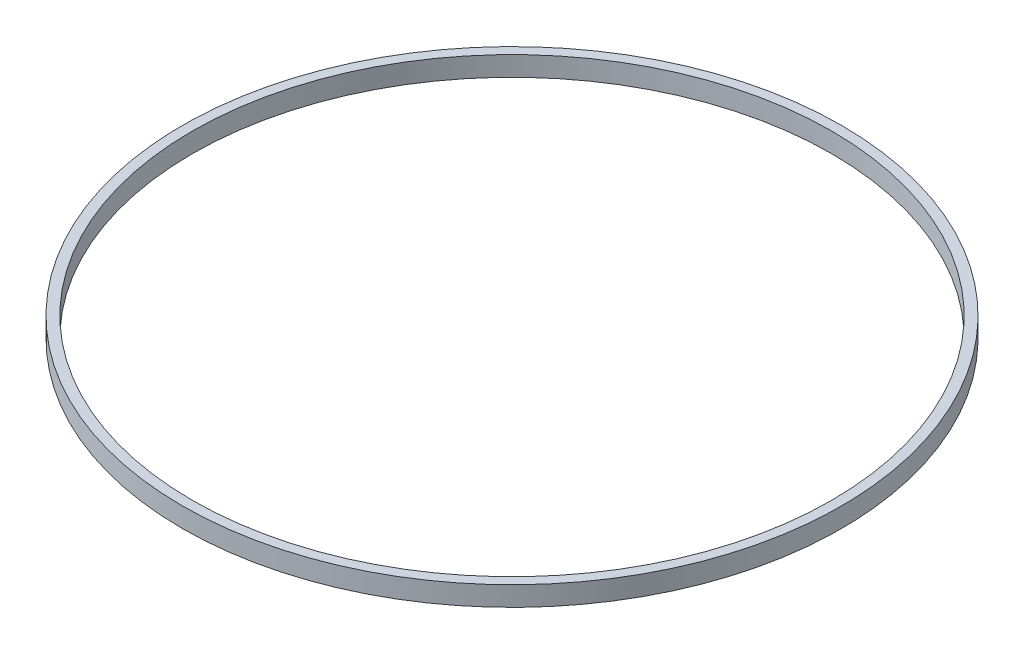
ISO-10303-21;
HEADER;
FILE_DESCRIPTION(('STEP AP214'),'2;1');
FILE_NAME('part.step','',(''),(''),'','','');
FILE_SCHEMA(('AUTOMOTIVE_DESIGN { 1 0 10303 214 1 1 1 1 }'));
ENDSEC;
DATA;
#1=APPLICATION_CONTEXT('core data for automotive mechanical design processes');
#2=APPLICATION_PROTOCOL_DEFINITION('international standard','automotive_design',2000,#1);
#3=PRODUCT_CONTEXT('',#1,'mechanical');
#4=PRODUCT('Part','Part','',(#3));
#5=PRODUCT_RELATED_PRODUCT_CATEGORY('part','',(#4));
#6=PRODUCT_DEFINITION_FORMATION('','',#4);
#7=PRODUCT_DEFINITION_CONTEXT('part definition',#1,'design');
#8=PRODUCT_DEFINITION('design','',#6,#7);
#9=PRODUCT_DEFINITION_SHAPE('','',#8);
#10=(LENGTH_UNIT() NAMED_UNIT(*) SI_UNIT(.MILLI.,.METRE.));
#11=(NAMED_UNIT(*) PLANE_ANGLE_UNIT() SI_UNIT($,.RADIAN.));
#12=(NAMED_UNIT(*) SI_UNIT($,.STERADIAN.) SOLID_ANGLE_UNIT());
#13=UNCERTAINTY_MEASURE_WITH_UNIT(LENGTH_MEASURE(1.E-05),#10,'distance_accuracy_value','');
#14=(GEOMETRIC_REPRESENTATION_CONTEXT(3) GLOBAL_UNCERTAINTY_ASSIGNED_CONTEXT((#13)) GLOBAL_UNIT_ASSIGNED_CONTEXT((#10,
#11,#12)) REPRESENTATION_CONTEXT('',''));
#15=CARTESIAN_POINT('',(0.,0.,0.));
#16=DIRECTION('',(0.,0.,1.));
#17=DIRECTION('',(1.,0.,0.));
#18=AXIS2_PLACEMENT_3D('',#15,#16,#17);
#19=CARTESIAN_POINT('',(0.,4.,0.));
#20=DIRECTION('',(0.,1.,0.));
#21=DIRECTION('',(0.,0.,1.));
#22=AXIS2_PLACEMENT_3D('',#19,#20,#21);
#23=PLANE('',#22);
#24=CARTESIAN_POINT('',(0.,4.,0.));
#25=DIRECTION('',(0.,1.,0.));
#26=DIRECTION('',(0.,0.,1.));
#27=AXIS2_PLACEMENT_3D('',#24,#25,#26);
#28=CIRCLE('',#27,67.1);
#29=CARTESIAN_POINT('',(0.,4.,67.1));
#30=VERTEX_POINT('',#29);
#31=EDGE_CURVE('E10',#30,#30,#28,.T.);
#32=ORIENTED_EDGE('',*,*,#31,.T.);
#33=EDGE_LOOP('',(#32));
#34=FACE_BOUND('',#33,.T.);
#35=CARTESIAN_POINT('',(0.,4.,0.));
#36=DIRECTION('',(0.,1.,0.));
#37=DIRECTION('',(0.,0.,1.));
#38=AXIS2_PLACEMENT_3D('',#35,#36,#37);
#39=CIRCLE('',#38,65.1);
#40=CARTESIAN_POINT('',(0.,4.,65.1));
#41=VERTEX_POINT('',#40);
#42=EDGE_CURVE('E44',#41,#41,#39,.T.);
#43=ORIENTED_EDGE('',*,*,#42,.F.);
#44=EDGE_LOOP('',(#43));
#45=FACE_BOUND('',#44,.T.);
#46=ADVANCED_FACE('F33',(#34,#45),#23,.T.);
#47=CARTESIAN_POINT('',(0.,0.,0.));
#48=DIRECTION('',(0.,1.,0.));
#49=DIRECTION('',(0.,0.,1.));
#50=AXIS2_PLACEMENT_3D('',#47,#48,#49);
#51=PLANE('',#50);
#52=CARTESIAN_POINT('',(0.,0.,0.));
#53=DIRECTION('',(0.,1.,0.));
#54=DIRECTION('',(0.,0.,1.));
#55=AXIS2_PLACEMENT_3D('',#52,#53,#54);
#56=CIRCLE('',#55,67.1);
#57=CARTESIAN_POINT('',(0.,0.,67.1));
#58=VERTEX_POINT('',#57);
#59=EDGE_CURVE('E37',#58,#58,#56,.T.);
#60=ORIENTED_EDGE('',*,*,#59,.F.);
#61=EDGE_LOOP('',(#60));
#62=FACE_BOUND('',#61,.T.);
#63=CARTESIAN_POINT('',(0.,0.,0.));
#64=DIRECTION('',(0.,1.,0.));
#65=DIRECTION('',(0.,0.,1.));
#66=AXIS2_PLACEMENT_3D('',#63,#64,#65);
#67=CIRCLE('',#66,65.1);
#68=CARTESIAN_POINT('',(0.,0.,65.1));
#69=VERTEX_POINT('',#68);
#70=EDGE_CURVE('E46',#69,#69,#67,.T.);
#71=ORIENTED_EDGE('',*,*,#70,.T.);
#72=EDGE_LOOP('',(#71));
#73=FACE_BOUND('',#72,.T.);
#74=ADVANCED_FACE('F56',(#62,#73),#51,.F.);
#75=CARTESIAN_POINT('',(0.,4.,0.));
#76=DIRECTION('',(0.,-1.,0.));
#77=DIRECTION('',(0.,0.,-1.));
#78=AXIS2_PLACEMENT_3D('',#75,#76,#77);
#79=CYLINDRICAL_SURFACE('',#78,67.1);
#80=ORIENTED_EDGE('',*,*,#31,.F.);
#81=EDGE_LOOP('',(#80));
#82=FACE_BOUND('',#81,.T.);
#83=ORIENTED_EDGE('',*,*,#59,.T.);
#84=EDGE_LOOP('',(#83));
#85=FACE_BOUND('',#84,.T.);
#86=ADVANCED_FACE('F35',(#82,#85),#79,.T.);
#87=CARTESIAN_POINT('',(0.,4.,0.));
#88=DIRECTION('',(0.,-1.,0.));
#89=DIRECTION('',(0.,0.,-1.));
#90=AXIS2_PLACEMENT_3D('',#87,#88,#89);
#91=CYLINDRICAL_SURFACE('',#90,65.1);
#92=ORIENTED_EDGE('',*,*,#42,.T.);
#93=EDGE_LOOP('',(#92));
#94=FACE_BOUND('',#93,.T.);
#95=ORIENTED_EDGE('',*,*,#70,.F.);
#96=EDGE_LOOP('',(#95));
#97=FACE_BOUND('',#96,.T.);
#98=ADVANCED_FACE('F52',(#94,#97),#91,.F.);
#99=CLOSED_SHELL('',(#46,#74,#86,#98));
#100=MANIFOLD_SOLID_BREP('B2',#99);
#101=ADVANCED_BREP_SHAPE_REPRESENTATION('',(#18,#100),#14);
#102=SHAPE_DEFINITION_REPRESENTATION(#9,#101);
ENDSEC;
END-ISO-10303-21;
